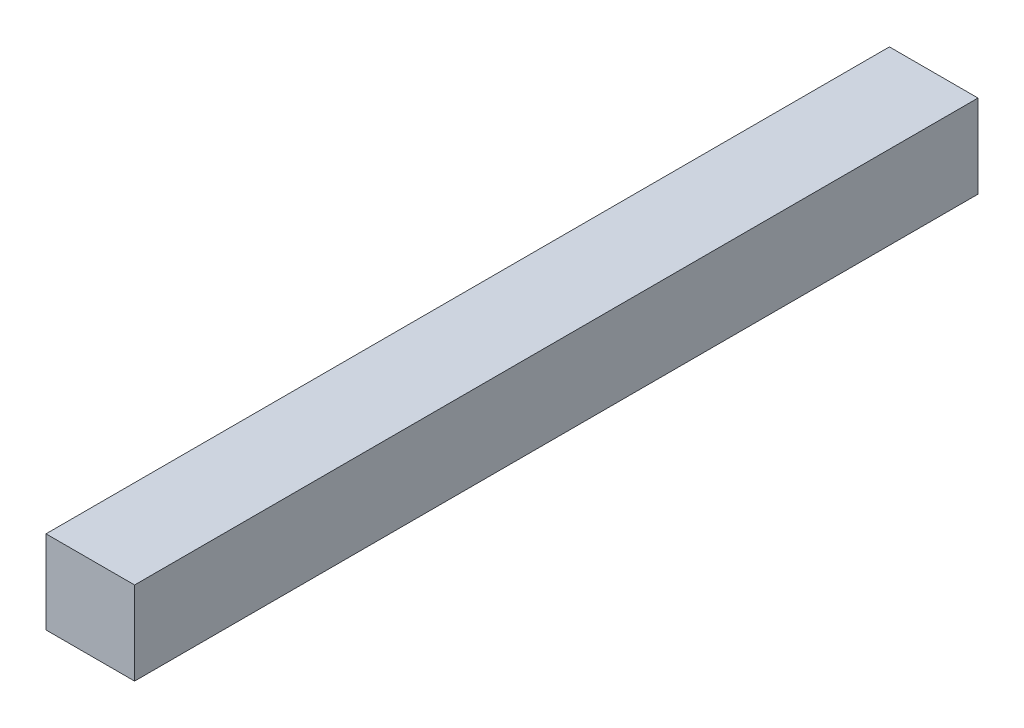
ISO-10303-21;
HEADER;
FILE_DESCRIPTION(('STEP AP214'),'2;1');
FILE_NAME('part.step','',(''),(''),'','','');
FILE_SCHEMA(('AUTOMOTIVE_DESIGN { 1 0 10303 214 1 1 1 1 }'));
ENDSEC;
DATA;
#1=APPLICATION_CONTEXT('core data for automotive mechanical design processes');
#2=APPLICATION_PROTOCOL_DEFINITION('international standard','automotive_design',2000,#1);
#3=PRODUCT_CONTEXT('',#1,'mechanical');
#4=PRODUCT('Part','Part','',(#3));
#5=PRODUCT_RELATED_PRODUCT_CATEGORY('part','',(#4));
#6=PRODUCT_DEFINITION_FORMATION('','',#4);
#7=PRODUCT_DEFINITION_CONTEXT('part definition',#1,'design');
#8=PRODUCT_DEFINITION('design','',#6,#7);
#9=PRODUCT_DEFINITION_SHAPE('','',#8);
#10=(LENGTH_UNIT() NAMED_UNIT(*) SI_UNIT(.MILLI.,.METRE.));
#11=(NAMED_UNIT(*) PLANE_ANGLE_UNIT() SI_UNIT($,.RADIAN.));
#12=(NAMED_UNIT(*) SI_UNIT($,.STERADIAN.) SOLID_ANGLE_UNIT());
#13=UNCERTAINTY_MEASURE_WITH_UNIT(LENGTH_MEASURE(1.E-05),#10,'distance_accuracy_value','');
#14=(GEOMETRIC_REPRESENTATION_CONTEXT(3) GLOBAL_UNCERTAINTY_ASSIGNED_CONTEXT((#13)) GLOBAL_UNIT_ASSIGNED_CONTEXT((#10,
#11,#12)) REPRESENTATION_CONTEXT('',''));
#15=CARTESIAN_POINT('',(0.,0.,0.));
#16=DIRECTION('',(0.,0.,1.));
#17=DIRECTION('',(1.,0.,0.));
#18=AXIS2_PLACEMENT_3D('',#15,#16,#17);
#19=CARTESIAN_POINT('',(-2683.71428571428,1702.57142857143,476.));
#20=DIRECTION('',(1.,0.,0.));
#21=DIRECTION('',(0.,0.,-1.));
#22=AXIS2_PLACEMENT_3D('',#19,#20,#21);
#23=PLANE('',#22);
#24=DIRECTION('',(0.,-1.,0.));
#25=VECTOR('',#24,1.);
#26=CARTESIAN_POINT('',(-2683.71428571428,1702.57142857143,0.));
#27=LINE('',#26,#25);
#28=CARTESIAN_POINT('',(-2683.71428571428,1702.57142857143,0.));
#29=VERTEX_POINT('',#28);
#30=CARTESIAN_POINT('',(-2683.71428571428,1655.57142857143,0.));
#31=VERTEX_POINT('',#30);
#32=EDGE_CURVE('E107',#29,#31,#27,.T.);
#33=ORIENTED_EDGE('',*,*,#32,.T.);
#34=DIRECTION('',(0.,0.,-1.));
#35=VECTOR('',#34,1.);
#36=CARTESIAN_POINT('',(-2683.71428571428,1655.57142857143,476.));
#37=LINE('',#36,#35);
#38=CARTESIAN_POINT('',(-2683.71428571428,1655.57142857143,476.));
#39=VERTEX_POINT('',#38);
#40=EDGE_CURVE('E11',#39,#31,#37,.T.);
#41=ORIENTED_EDGE('',*,*,#40,.F.);
#42=DIRECTION('',(0.,-1.,0.));
#43=VECTOR('',#42,1.);
#44=CARTESIAN_POINT('',(-2683.71428571428,1702.57142857143,476.));
#45=LINE('',#44,#43);
#46=CARTESIAN_POINT('',(-2683.71428571428,1702.57142857143,476.));
#47=VERTEX_POINT('',#46);
#48=EDGE_CURVE('E91',#47,#39,#45,.T.);
#49=ORIENTED_EDGE('',*,*,#48,.F.);
#50=DIRECTION('',(0.,0.,-1.));
#51=VECTOR('',#50,1.);
#52=CARTESIAN_POINT('',(-2683.71428571428,1702.57142857143,476.));
#53=LINE('',#52,#51);
#54=EDGE_CURVE('E103',#47,#29,#53,.T.);
#55=ORIENTED_EDGE('',*,*,#54,.T.);
#56=EDGE_LOOP('',(#33,#41,#49,#55));
#57=FACE_BOUND('',#56,.T.);
#58=ADVANCED_FACE('F39',(#57),#23,.F.);
#59=CARTESIAN_POINT('',(-2683.71428571428,1655.57142857143,476.));
#60=DIRECTION('',(0.,1.,0.));
#61=DIRECTION('',(0.,0.,1.));
#62=AXIS2_PLACEMENT_3D('',#59,#60,#61);
#63=PLANE('',#62);
#64=DIRECTION('',(1.,0.,0.));
#65=VECTOR('',#64,1.);
#66=CARTESIAN_POINT('',(-2683.71428571428,1655.57142857143,0.));
#67=LINE('',#66,#65);
#68=CARTESIAN_POINT('',(-2633.71428571428,1655.57142857143,0.));
#69=VERTEX_POINT('',#68);
#70=EDGE_CURVE('E96',#31,#69,#67,.T.);
#71=ORIENTED_EDGE('',*,*,#70,.T.);
#72=DIRECTION('',(0.,0.,-1.));
#73=VECTOR('',#72,1.);
#74=CARTESIAN_POINT('',(-2633.71428571428,1655.57142857143,476.));
#75=LINE('',#74,#73);
#76=CARTESIAN_POINT('',(-2633.71428571428,1655.57142857143,476.));
#77=VERTEX_POINT('',#76);
#78=EDGE_CURVE('E48',#77,#69,#75,.T.);
#79=ORIENTED_EDGE('',*,*,#78,.F.);
#80=DIRECTION('',(1.,0.,0.));
#81=VECTOR('',#80,1.);
#82=CARTESIAN_POINT('',(-2683.71428571428,1655.57142857143,476.));
#83=LINE('',#82,#81);
#84=EDGE_CURVE('E86',#39,#77,#83,.T.);
#85=ORIENTED_EDGE('',*,*,#84,.F.);
#86=ORIENTED_EDGE('',*,*,#40,.T.);
#87=EDGE_LOOP('',(#71,#79,#85,#86));
#88=FACE_BOUND('',#87,.T.);
#89=ADVANCED_FACE('F95',(#88),#63,.F.);
#90=CARTESIAN_POINT('',(-2633.71428571428,1702.57142857143,476.));
#91=DIRECTION('',(-1.,0.,0.));
#92=DIRECTION('',(0.,-1.,0.));
#93=AXIS2_PLACEMENT_3D('',#90,#91,#92);
#94=PLANE('',#93);
#95=DIRECTION('',(0.,1.,0.));
#96=VECTOR('',#95,1.);
#97=CARTESIAN_POINT('',(-2633.71428571428,1702.57142857143,0.));
#98=LINE('',#97,#96);
#99=CARTESIAN_POINT('',(-2633.71428571428,1702.57142857143,0.));
#100=VERTEX_POINT('',#99);
#101=EDGE_CURVE('E73',#69,#100,#98,.T.);
#102=ORIENTED_EDGE('',*,*,#101,.T.);
#103=DIRECTION('',(0.,0.,-1.));
#104=VECTOR('',#103,1.);
#105=CARTESIAN_POINT('',(-2633.71428571428,1702.57142857143,476.));
#106=LINE('',#105,#104);
#107=CARTESIAN_POINT('',(-2633.71428571428,1702.57142857143,476.));
#108=VERTEX_POINT('',#107);
#109=EDGE_CURVE('E98',#108,#100,#106,.T.);
#110=ORIENTED_EDGE('',*,*,#109,.F.);
#111=DIRECTION('',(0.,1.,0.));
#112=VECTOR('',#111,1.);
#113=CARTESIAN_POINT('',(-2633.71428571428,1702.57142857143,476.));
#114=LINE('',#113,#112);
#115=EDGE_CURVE('E89',#77,#108,#114,.T.);
#116=ORIENTED_EDGE('',*,*,#115,.F.);
#117=ORIENTED_EDGE('',*,*,#78,.T.);
#118=EDGE_LOOP('',(#102,#110,#116,#117));
#119=FACE_BOUND('',#118,.T.);
#120=ADVANCED_FACE('F99',(#119),#94,.F.);
#121=CARTESIAN_POINT('',(-2683.71428571428,1702.57142857143,476.));
#122=DIRECTION('',(0.,-1.,0.));
#123=DIRECTION('',(0.,0.,-1.));
#124=AXIS2_PLACEMENT_3D('',#121,#122,#123);
#125=PLANE('',#124);
#126=DIRECTION('',(-1.,0.,0.));
#127=VECTOR('',#126,1.);
#128=CARTESIAN_POINT('',(-2683.71428571428,1702.57142857143,0.));
#129=LINE('',#128,#127);
#130=EDGE_CURVE('E79',#100,#29,#129,.T.);
#131=ORIENTED_EDGE('',*,*,#130,.T.);
#132=ORIENTED_EDGE('',*,*,#54,.F.);
#133=DIRECTION('',(-1.,0.,0.));
#134=VECTOR('',#133,1.);
#135=CARTESIAN_POINT('',(-2683.71428571428,1702.57142857143,476.));
#136=LINE('',#135,#134);
#137=EDGE_CURVE('E56',#108,#47,#136,.T.);
#138=ORIENTED_EDGE('',*,*,#137,.F.);
#139=ORIENTED_EDGE('',*,*,#109,.T.);
#140=EDGE_LOOP('',(#131,#132,#138,#139));
#141=FACE_BOUND('',#140,.T.);
#142=ADVANCED_FACE('F120',(#141),#125,.F.);
#143=CARTESIAN_POINT('',(0.,0.,476.));
#144=DIRECTION('',(0.,0.,1.));
#145=DIRECTION('',(1.,0.,0.));
#146=AXIS2_PLACEMENT_3D('',#143,#144,#145);
#147=PLANE('',#146);
#148=ORIENTED_EDGE('',*,*,#48,.T.);
#149=ORIENTED_EDGE('',*,*,#84,.T.);
#150=ORIENTED_EDGE('',*,*,#115,.T.);
#151=ORIENTED_EDGE('',*,*,#137,.T.);
#152=EDGE_LOOP('',(#148,#149,#150,#151));
#153=FACE_BOUND('',#152,.T.);
#154=ADVANCED_FACE('F87',(#153),#147,.T.);
#155=CARTESIAN_POINT('',(0.,0.,0.));
#156=DIRECTION('',(0.,0.,1.));
#157=DIRECTION('',(1.,0.,0.));
#158=AXIS2_PLACEMENT_3D('',#155,#156,#157);
#159=PLANE('',#158);
#160=ORIENTED_EDGE('',*,*,#32,.F.);
#161=ORIENTED_EDGE('',*,*,#130,.F.);
#162=ORIENTED_EDGE('',*,*,#101,.F.);
#163=ORIENTED_EDGE('',*,*,#70,.F.);
#164=EDGE_LOOP('',(#160,#161,#162,#163));
#165=FACE_BOUND('',#164,.T.);
#166=ADVANCED_FACE('F123',(#165),#159,.F.);
#167=CLOSED_SHELL('',(#58,#89,#120,#142,#154,#166));
#168=MANIFOLD_SOLID_BREP('B2',#167);
#169=ADVANCED_BREP_SHAPE_REPRESENTATION('',(#18,#168),#14);
#170=SHAPE_DEFINITION_REPRESENTATION(#9,#169);
ENDSEC;
END-ISO-10303-21;
